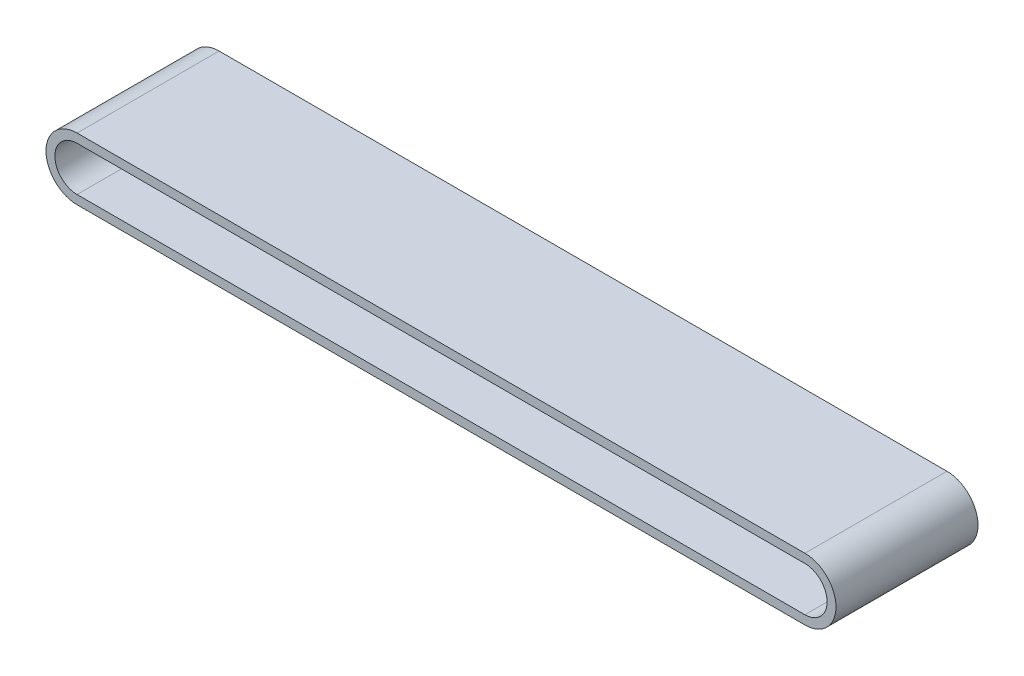
ISO-10303-21;
HEADER;
FILE_DESCRIPTION(('STEP AP214'),'2;1');
FILE_NAME('part.step','',(''),(''),'','','');
FILE_SCHEMA(('AUTOMOTIVE_DESIGN { 1 0 10303 214 1 1 1 1 }'));
ENDSEC;
DATA;
#1=APPLICATION_CONTEXT('core data for automotive mechanical design processes');
#2=APPLICATION_PROTOCOL_DEFINITION('international standard','automotive_design',2000,#1);
#3=PRODUCT_CONTEXT('',#1,'mechanical');
#4=PRODUCT('Part','Part','',(#3));
#5=PRODUCT_RELATED_PRODUCT_CATEGORY('part','',(#4));
#6=PRODUCT_DEFINITION_FORMATION('','',#4);
#7=PRODUCT_DEFINITION_CONTEXT('part definition',#1,'design');
#8=PRODUCT_DEFINITION('design','',#6,#7);
#9=PRODUCT_DEFINITION_SHAPE('','',#8);
#10=(LENGTH_UNIT() NAMED_UNIT(*) SI_UNIT(.MILLI.,.METRE.));
#11=(NAMED_UNIT(*) PLANE_ANGLE_UNIT() SI_UNIT($,.RADIAN.));
#12=(NAMED_UNIT(*) SI_UNIT($,.STERADIAN.) SOLID_ANGLE_UNIT());
#13=UNCERTAINTY_MEASURE_WITH_UNIT(LENGTH_MEASURE(1.E-05),#10,'distance_accuracy_value','');
#14=(GEOMETRIC_REPRESENTATION_CONTEXT(3) GLOBAL_UNCERTAINTY_ASSIGNED_CONTEXT((#13)) GLOBAL_UNIT_ASSIGNED_CONTEXT((#10,
#11,#12)) REPRESENTATION_CONTEXT('',''));
#15=CARTESIAN_POINT('',(0.,0.,0.));
#16=DIRECTION('',(0.,0.,1.));
#17=DIRECTION('',(1.,0.,0.));
#18=AXIS2_PLACEMENT_3D('',#15,#16,#17);
#19=CARTESIAN_POINT('',(3.54361474789595E-05,-10.7609738963274,80.));
#20=DIRECTION('',(-3.29302420209953E-06,0.999999999994578,0.));
#21=DIRECTION('',(-0.999999999994578,-3.29302420209953E-06,0.));
#22=AXIS2_PLACEMENT_3D('',#19,#20,#21);
#23=PLANE('',#22);
#24=DIRECTION('',(0.999999999994578,3.29302420209953E-06,0.));
#25=VECTOR('',#24,1.);
#26=CARTESIAN_POINT('',(3.54361474789595E-05,-10.7609738963274,0.));
#27=LINE('',#26,#25);
#28=CARTESIAN_POINT('',(-244.768384079437,-10.7617799246568,0.));
#29=VERTEX_POINT('',#28);
#30=CARTESIAN_POINT('',(165.449051274599,-10.760429068714,0.));
#31=VERTEX_POINT('',#30);
#32=EDGE_CURVE('E145',#29,#31,#27,.T.);
#33=ORIENTED_EDGE('',*,*,#32,.T.);
#34=DIRECTION('',(0.,0.,-1.));
#35=VECTOR('',#34,1.);
#36=CARTESIAN_POINT('',(165.449051274599,-10.760429068714,80.));
#37=LINE('',#36,#35);
#38=CARTESIAN_POINT('',(165.449051274599,-10.760429068714,80.));
#39=VERTEX_POINT('',#38);
#40=EDGE_CURVE('E11',#39,#31,#37,.T.);
#41=ORIENTED_EDGE('',*,*,#40,.F.);
#42=DIRECTION('',(0.999999999994578,3.29302420209953E-06,0.));
#43=VECTOR('',#42,1.);
#44=CARTESIAN_POINT('',(3.54361474789595E-05,-10.7609738963274,80.));
#45=LINE('',#44,#43);
#46=CARTESIAN_POINT('',(-244.768384079437,-10.7617799246568,80.));
#47=VERTEX_POINT('',#46);
#48=EDGE_CURVE('E116',#47,#39,#45,.T.);
#49=ORIENTED_EDGE('',*,*,#48,.F.);
#50=DIRECTION('',(0.,0.,-1.));
#51=VECTOR('',#50,1.);
#52=CARTESIAN_POINT('',(-244.768384079437,-10.7617799246568,80.));
#53=LINE('',#52,#51);
#54=EDGE_CURVE('E153',#47,#29,#53,.T.);
#55=ORIENTED_EDGE('',*,*,#54,.T.);
#56=EDGE_LOOP('',(#33,#41,#49,#55));
#57=FACE_BOUND('',#56,.T.);
#58=ADVANCED_FACE('F39',(#57),#23,.F.);
#59=CARTESIAN_POINT('',(165.231615920563,6.73822007534323,80.));
#60=DIRECTION('',(0.,0.,-1.));
#61=DIRECTION('',(-1.,0.,0.));
#62=AXIS2_PLACEMENT_3D('',#59,#60,#61);
#63=CYLINDRICAL_SURFACE('',#62,17.5);
#64=CARTESIAN_POINT('',(165.231615920563,6.73822007534323,0.));
#65=DIRECTION('',(0.,0.,1.));
#66=DIRECTION('',(1.,0.,0.));
#67=AXIS2_PLACEMENT_3D('',#64,#65,#66);
#68=CIRCLE('',#67,17.5);
#69=CARTESIAN_POINT('',(165.23161592059,24.2382200753432,0.));
#70=VERTEX_POINT('',#69);
#71=EDGE_CURVE('E122',#31,#70,#68,.T.);
#72=ORIENTED_EDGE('',*,*,#71,.T.);
#73=DIRECTION('',(0.,0.,-1.));
#74=VECTOR('',#73,1.);
#75=CARTESIAN_POINT('',(165.23161592059,24.2382200753432,80.));
#76=LINE('',#75,#74);
#77=CARTESIAN_POINT('',(165.23161592059,24.2382200753432,80.));
#78=VERTEX_POINT('',#77);
#79=EDGE_CURVE('E49',#78,#70,#76,.T.);
#80=ORIENTED_EDGE('',*,*,#79,.F.);
#81=CARTESIAN_POINT('',(165.231615920563,6.73822007534323,80.));
#82=DIRECTION('',(0.,0.,1.));
#83=DIRECTION('',(1.,0.,0.));
#84=AXIS2_PLACEMENT_3D('',#81,#82,#83);
#85=CIRCLE('',#84,17.5);
#86=EDGE_CURVE('E110',#39,#78,#85,.T.);
#87=ORIENTED_EDGE('',*,*,#86,.F.);
#88=ORIENTED_EDGE('',*,*,#40,.T.);
#89=EDGE_LOOP('',(#72,#80,#87,#88));
#90=FACE_BOUND('',#89,.T.);
#91=ADVANCED_FACE('F121',(#90),#63,.T.);
#92=CARTESIAN_POINT('',(0.,24.2382200753432,80.));
#93=DIRECTION('',(0.,1.,0.));
#94=DIRECTION('',(0.,0.,1.));
#95=AXIS2_PLACEMENT_3D('',#92,#93,#94);
#96=PLANE('',#95);
#97=DIRECTION('',(1.,0.,0.));
#98=VECTOR('',#97,1.);
#99=CARTESIAN_POINT('',(0.,24.2382200753432,0.));
#100=LINE('',#99,#98);
#101=CARTESIAN_POINT('',(-244.768384079437,24.2382200753432,0.));
#102=VERTEX_POINT('',#101);
#103=EDGE_CURVE('E149',#102,#70,#100,.T.);
#104=ORIENTED_EDGE('',*,*,#103,.F.);
#105=DIRECTION('',(0.,0.,-1.));
#106=VECTOR('',#105,1.);
#107=CARTESIAN_POINT('',(-244.768384079437,24.2382200753432,80.));
#108=LINE('',#107,#106);
#109=CARTESIAN_POINT('',(-244.768384079437,24.2382200753432,80.));
#110=VERTEX_POINT('',#109);
#111=EDGE_CURVE('E86',#110,#102,#108,.T.);
#112=ORIENTED_EDGE('',*,*,#111,.F.);
#113=DIRECTION('',(1.,0.,0.));
#114=VECTOR('',#113,1.);
#115=CARTESIAN_POINT('',(0.,24.2382200753432,80.));
#116=LINE('',#115,#114);
#117=EDGE_CURVE('E114',#110,#78,#116,.T.);
#118=ORIENTED_EDGE('',*,*,#117,.T.);
#119=ORIENTED_EDGE('',*,*,#79,.T.);
#120=EDGE_LOOP('',(#104,#112,#118,#119));
#121=FACE_BOUND('',#120,.T.);
#122=ADVANCED_FACE('F127',(#121),#96,.T.);
#123=CARTESIAN_POINT('',(165.231615920563,6.73822007534323,80.));
#124=DIRECTION('',(0.,0.,-1.));
#125=DIRECTION('',(-1.,0.,0.));
#126=AXIS2_PLACEMENT_3D('',#123,#124,#125);
#127=CYLINDRICAL_SURFACE('',#126,12.5);
#128=CARTESIAN_POINT('',(165.231615920563,6.73822007534323,0.));
#129=DIRECTION('',(0.,0.,1.));
#130=DIRECTION('',(1.,0.,0.));
#131=AXIS2_PLACEMENT_3D('',#128,#129,#130);
#132=CIRCLE('',#131,12.5);
#133=CARTESIAN_POINT('',(165.231615920595,-5.76177992465677,0.));
#134=VERTEX_POINT('',#133);
#135=CARTESIAN_POINT('',(165.231615920595,19.2382200753432,0.));
#136=VERTEX_POINT('',#135);
#137=EDGE_CURVE('E133',#134,#136,#132,.T.);
#138=ORIENTED_EDGE('',*,*,#137,.F.);
#139=DIRECTION('',(0.,0.,-1.));
#140=VECTOR('',#139,1.);
#141=CARTESIAN_POINT('',(165.231615920595,-5.76177992465677,80.));
#142=LINE('',#141,#140);
#143=CARTESIAN_POINT('',(165.231615920595,-5.76177992465677,80.));
#144=VERTEX_POINT('',#143);
#145=EDGE_CURVE('E43',#144,#134,#142,.T.);
#146=ORIENTED_EDGE('',*,*,#145,.F.);
#147=CARTESIAN_POINT('',(165.231615920563,6.73822007534323,80.));
#148=DIRECTION('',(0.,0.,1.));
#149=DIRECTION('',(1.,0.,0.));
#150=AXIS2_PLACEMENT_3D('',#147,#148,#149);
#151=CIRCLE('',#150,12.5);
#152=CARTESIAN_POINT('',(165.231615920595,19.2382200753432,80.));
#153=VERTEX_POINT('',#152);
#154=EDGE_CURVE('E152',#144,#153,#151,.T.);
#155=ORIENTED_EDGE('',*,*,#154,.T.);
#156=DIRECTION('',(0.,0.,-1.));
#157=VECTOR('',#156,1.);
#158=CARTESIAN_POINT('',(165.231615920595,19.2382200753432,80.));
#159=LINE('',#158,#157);
#160=EDGE_CURVE('E129',#153,#136,#159,.T.);
#161=ORIENTED_EDGE('',*,*,#160,.T.);
#162=EDGE_LOOP('',(#138,#146,#155,#161));
#163=FACE_BOUND('',#162,.T.);
#164=ADVANCED_FACE('F41',(#163),#127,.F.);
#165=CARTESIAN_POINT('',(0.,-5.76177992465677,80.));
#166=DIRECTION('',(0.,1.,0.));
#167=DIRECTION('',(0.,0.,1.));
#168=AXIS2_PLACEMENT_3D('',#165,#166,#167);
#169=PLANE('',#168);
#170=DIRECTION('',(1.,0.,0.));
#171=VECTOR('',#170,1.);
#172=CARTESIAN_POINT('',(0.,-5.76177992465677,0.));
#173=LINE('',#172,#171);
#174=CARTESIAN_POINT('',(-244.768384079437,-5.76177992465677,0.));
#175=VERTEX_POINT('',#174);
#176=EDGE_CURVE('E136',#175,#134,#173,.T.);
#177=ORIENTED_EDGE('',*,*,#176,.F.);
#178=DIRECTION('',(0.,0.,-1.));
#179=VECTOR('',#178,1.);
#180=CARTESIAN_POINT('',(-244.768384079437,-5.76177992465677,80.));
#181=LINE('',#180,#179);
#182=CARTESIAN_POINT('',(-244.768384079437,-5.76177992465677,80.));
#183=VERTEX_POINT('',#182);
#184=EDGE_CURVE('E158',#183,#175,#181,.T.);
#185=ORIENTED_EDGE('',*,*,#184,.F.);
#186=DIRECTION('',(1.,0.,0.));
#187=VECTOR('',#186,1.);
#188=CARTESIAN_POINT('',(0.,-5.76177992465677,80.));
#189=LINE('',#188,#187);
#190=EDGE_CURVE('E167',#183,#144,#189,.T.);
#191=ORIENTED_EDGE('',*,*,#190,.T.);
#192=ORIENTED_EDGE('',*,*,#145,.T.);
#193=EDGE_LOOP('',(#177,#185,#191,#192));
#194=FACE_BOUND('',#193,.T.);
#195=ADVANCED_FACE('F165',(#194),#169,.T.);
#196=CARTESIAN_POINT('',(-244.768384079437,6.73822007534323,80.));
#197=DIRECTION('',(0.,0.,-1.));
#198=DIRECTION('',(-1.,0.,0.));
#199=AXIS2_PLACEMENT_3D('',#196,#197,#198);
#200=CYLINDRICAL_SURFACE('',#199,12.5);
#201=CARTESIAN_POINT('',(-244.768384079437,6.73822007534323,0.));
#202=DIRECTION('',(0.,0.,1.));
#203=DIRECTION('',(1.,0.,0.));
#204=AXIS2_PLACEMENT_3D('',#201,#202,#203);
#205=CIRCLE('',#204,12.5);
#206=CARTESIAN_POINT('',(-244.768384079437,19.2382200753432,0.));
#207=VERTEX_POINT('',#206);
#208=EDGE_CURVE('E139',#207,#175,#205,.T.);
#209=ORIENTED_EDGE('',*,*,#208,.F.);
#210=DIRECTION('',(0.,0.,-1.));
#211=VECTOR('',#210,1.);
#212=CARTESIAN_POINT('',(-244.768384079437,19.2382200753432,80.));
#213=LINE('',#212,#211);
#214=CARTESIAN_POINT('',(-244.768384079437,19.2382200753432,80.));
#215=VERTEX_POINT('',#214);
#216=EDGE_CURVE('E157',#215,#207,#213,.T.);
#217=ORIENTED_EDGE('',*,*,#216,.F.);
#218=CARTESIAN_POINT('',(-244.768384079437,6.73822007534323,80.));
#219=DIRECTION('',(0.,0.,1.));
#220=DIRECTION('',(1.,0.,0.));
#221=AXIS2_PLACEMENT_3D('',#218,#219,#220);
#222=CIRCLE('',#221,12.5);
#223=EDGE_CURVE('E176',#215,#183,#222,.T.);
#224=ORIENTED_EDGE('',*,*,#223,.T.);
#225=ORIENTED_EDGE('',*,*,#184,.T.);
#226=EDGE_LOOP('',(#209,#217,#224,#225));
#227=FACE_BOUND('',#226,.T.);
#228=ADVANCED_FACE('F173',(#227),#200,.F.);
#229=CARTESIAN_POINT('',(0.,19.2382200753432,80.));
#230=DIRECTION('',(0.,1.,0.));
#231=DIRECTION('',(0.,0.,1.));
#232=AXIS2_PLACEMENT_3D('',#229,#230,#231);
#233=PLANE('',#232);
#234=DIRECTION('',(1.,0.,0.));
#235=VECTOR('',#234,1.);
#236=CARTESIAN_POINT('',(0.,19.2382200753432,0.));
#237=LINE('',#236,#235);
#238=EDGE_CURVE('E142',#207,#136,#237,.T.);
#239=ORIENTED_EDGE('',*,*,#238,.T.);
#240=ORIENTED_EDGE('',*,*,#160,.F.);
#241=DIRECTION('',(1.,0.,0.));
#242=VECTOR('',#241,1.);
#243=CARTESIAN_POINT('',(0.,19.2382200753432,80.));
#244=LINE('',#243,#242);
#245=EDGE_CURVE('E178',#215,#153,#244,.T.);
#246=ORIENTED_EDGE('',*,*,#245,.F.);
#247=ORIENTED_EDGE('',*,*,#216,.T.);
#248=EDGE_LOOP('',(#239,#240,#246,#247));
#249=FACE_BOUND('',#248,.T.);
#250=ADVANCED_FACE('F179',(#249),#233,.F.);
#251=CARTESIAN_POINT('',(-244.768384079437,6.73822007534323,80.));
#252=DIRECTION('',(0.,0.,-1.));
#253=DIRECTION('',(-1.,0.,0.));
#254=AXIS2_PLACEMENT_3D('',#251,#252,#253);
#255=CYLINDRICAL_SURFACE('',#254,17.5);
#256=CARTESIAN_POINT('',(-244.768384079437,6.73822007534323,0.));
#257=DIRECTION('',(0.,0.,1.));
#258=DIRECTION('',(1.,0.,0.));
#259=AXIS2_PLACEMENT_3D('',#256,#257,#258);
#260=CIRCLE('',#259,17.5);
#261=EDGE_CURVE('E89',#102,#29,#260,.T.);
#262=ORIENTED_EDGE('',*,*,#261,.T.);
#263=ORIENTED_EDGE('',*,*,#54,.F.);
#264=CARTESIAN_POINT('',(-244.768384079437,6.73822007534323,80.));
#265=DIRECTION('',(0.,0.,1.));
#266=DIRECTION('',(1.,0.,0.));
#267=AXIS2_PLACEMENT_3D('',#264,#265,#266);
#268=CIRCLE('',#267,17.5);
#269=EDGE_CURVE('E58',#110,#47,#268,.T.);
#270=ORIENTED_EDGE('',*,*,#269,.F.);
#271=ORIENTED_EDGE('',*,*,#111,.T.);
#272=EDGE_LOOP('',(#262,#263,#270,#271));
#273=FACE_BOUND('',#272,.T.);
#274=ADVANCED_FACE('F186',(#273),#255,.T.);
#275=CARTESIAN_POINT('',(0.,0.,80.));
#276=DIRECTION('',(0.,0.,1.));
#277=DIRECTION('',(1.,0.,0.));
#278=AXIS2_PLACEMENT_3D('',#275,#276,#277);
#279=PLANE('',#278);
#280=ORIENTED_EDGE('',*,*,#154,.F.);
#281=ORIENTED_EDGE('',*,*,#190,.F.);
#282=ORIENTED_EDGE('',*,*,#223,.F.);
#283=ORIENTED_EDGE('',*,*,#245,.T.);
#284=EDGE_LOOP('',(#280,#281,#282,#283));
#285=FACE_BOUND('',#284,.T.);
#286=ORIENTED_EDGE('',*,*,#48,.T.);
#287=ORIENTED_EDGE('',*,*,#86,.T.);
#288=ORIENTED_EDGE('',*,*,#117,.F.);
#289=ORIENTED_EDGE('',*,*,#269,.T.);
#290=EDGE_LOOP('',(#286,#287,#288,#289));
#291=FACE_BOUND('',#290,.T.);
#292=ADVANCED_FACE('F112',(#285,#291),#279,.T.);
#293=CARTESIAN_POINT('',(0.,0.,0.));
#294=DIRECTION('',(0.,0.,1.));
#295=DIRECTION('',(1.,0.,0.));
#296=AXIS2_PLACEMENT_3D('',#293,#294,#295);
#297=PLANE('',#296);
#298=ORIENTED_EDGE('',*,*,#137,.T.);
#299=ORIENTED_EDGE('',*,*,#238,.F.);
#300=ORIENTED_EDGE('',*,*,#208,.T.);
#301=ORIENTED_EDGE('',*,*,#176,.T.);
#302=EDGE_LOOP('',(#298,#299,#300,#301));
#303=FACE_BOUND('',#302,.T.);
#304=ORIENTED_EDGE('',*,*,#32,.F.);
#305=ORIENTED_EDGE('',*,*,#261,.F.);
#306=ORIENTED_EDGE('',*,*,#103,.T.);
#307=ORIENTED_EDGE('',*,*,#71,.F.);
#308=EDGE_LOOP('',(#304,#305,#306,#307));
#309=FACE_BOUND('',#308,.T.);
#310=ADVANCED_FACE('F171',(#303,#309),#297,.F.);
#311=CLOSED_SHELL('',(#58,#91,#122,#164,#195,#228,#250,#274,#292,#310));
#312=MANIFOLD_SOLID_BREP('B2',#311);
#313=ADVANCED_BREP_SHAPE_REPRESENTATION('',(#18,#312),#14);
#314=SHAPE_DEFINITION_REPRESENTATION(#9,#313);
ENDSEC;
END-ISO-10303-21;
